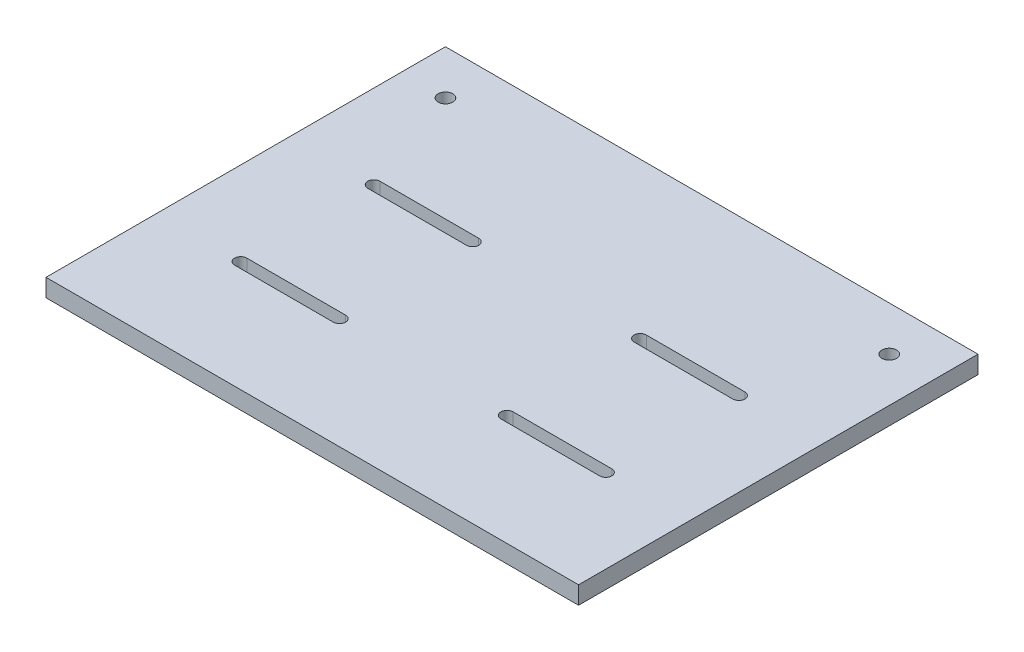
ISO-10303-21;
HEADER;
FILE_DESCRIPTION(('STEP AP214'),'2;1');
FILE_NAME('part.step','',(''),(''),'','','');
FILE_SCHEMA(('AUTOMOTIVE_DESIGN { 1 0 10303 214 1 1 1 1 }'));
ENDSEC;
DATA;
#1=APPLICATION_CONTEXT('core data for automotive mechanical design processes');
#2=APPLICATION_PROTOCOL_DEFINITION('international standard','automotive_design',2000,#1);
#3=PRODUCT_CONTEXT('',#1,'mechanical');
#4=PRODUCT('Part','Part','',(#3));
#5=PRODUCT_RELATED_PRODUCT_CATEGORY('part','',(#4));
#6=PRODUCT_DEFINITION_FORMATION('','',#4);
#7=PRODUCT_DEFINITION_CONTEXT('part definition',#1,'design');
#8=PRODUCT_DEFINITION('design','',#6,#7);
#9=PRODUCT_DEFINITION_SHAPE('','',#8);
#10=(LENGTH_UNIT() NAMED_UNIT(*) SI_UNIT(.MILLI.,.METRE.));
#11=(NAMED_UNIT(*) PLANE_ANGLE_UNIT() SI_UNIT($,.RADIAN.));
#12=(NAMED_UNIT(*) SI_UNIT($,.STERADIAN.) SOLID_ANGLE_UNIT());
#13=UNCERTAINTY_MEASURE_WITH_UNIT(LENGTH_MEASURE(1.E-05),#10,'distance_accuracy_value','');
#14=(GEOMETRIC_REPRESENTATION_CONTEXT(3) GLOBAL_UNCERTAINTY_ASSIGNED_CONTEXT((#13)) GLOBAL_UNIT_ASSIGNED_CONTEXT((#10,
#11,#12)) REPRESENTATION_CONTEXT('',''));
#15=CARTESIAN_POINT('',(0.,0.,0.));
#16=DIRECTION('',(0.,0.,1.));
#17=DIRECTION('',(1.,0.,0.));
#18=AXIS2_PLACEMENT_3D('',#15,#16,#17);
#19=CARTESIAN_POINT('',(0.,8.0023,0.));
#20=DIRECTION('',(0.,-1.,0.));
#21=DIRECTION('',(0.,0.,-1.));
#22=AXIS2_PLACEMENT_3D('',#19,#20,#21);
#23=PLANE('',#22);
#24=CARTESIAN_POINT('',(202.25,8.0023,130.));
#25=DIRECTION('',(0.,1.,0.));
#26=DIRECTION('',(0.,0.,1.));
#27=AXIS2_PLACEMENT_3D('',#24,#25,#26);
#28=CIRCLE('',#27,2.75);
#29=CARTESIAN_POINT('',(202.25,8.0023,127.25));
#30=VERTEX_POINT('',#29);
#31=CARTESIAN_POINT('',(202.25,8.0023,132.75));
#32=VERTEX_POINT('',#31);
#33=EDGE_CURVE('E252',#30,#32,#28,.F.);
#34=ORIENTED_EDGE('',*,*,#33,.T.);
#35=DIRECTION('',(1.,0.,0.));
#36=VECTOR('',#35,1.);
#37=CARTESIAN_POINT('',(157.75,8.0023,132.75));
#38=LINE('',#37,#36);
#39=CARTESIAN_POINT('',(157.75,8.0023,132.75));
#40=VERTEX_POINT('',#39);
#41=EDGE_CURVE('E181',#32,#40,#38,.F.);
#42=ORIENTED_EDGE('',*,*,#41,.T.);
#43=CARTESIAN_POINT('',(157.75,8.0023,130.));
#44=DIRECTION('',(0.,1.,0.));
#45=DIRECTION('',(0.,0.,1.));
#46=AXIS2_PLACEMENT_3D('',#43,#44,#45);
#47=CIRCLE('',#46,2.75);
#48=CARTESIAN_POINT('',(157.75,8.0023,127.25));
#49=VERTEX_POINT('',#48);
#50=EDGE_CURVE('E189',#40,#49,#47,.F.);
#51=ORIENTED_EDGE('',*,*,#50,.T.);
#52=DIRECTION('',(-1.,0.,0.));
#53=VECTOR('',#52,1.);
#54=CARTESIAN_POINT('',(202.25,8.0023,127.25));
#55=LINE('',#54,#53);
#56=EDGE_CURVE('E176',#49,#30,#55,.F.);
#57=ORIENTED_EDGE('',*,*,#56,.T.);
#58=EDGE_LOOP('',(#34,#42,#51,#57));
#59=FACE_BOUND('',#58,.T.);
#60=CARTESIAN_POINT('',(82.25,8.0023,130.));
#61=DIRECTION('',(0.,1.,0.));
#62=DIRECTION('',(0.,0.,1.));
#63=AXIS2_PLACEMENT_3D('',#60,#61,#62);
#64=CIRCLE('',#63,2.75);
#65=CARTESIAN_POINT('',(82.25,8.0023,127.25));
#66=VERTEX_POINT('',#65);
#67=CARTESIAN_POINT('',(82.25,8.0023,132.75));
#68=VERTEX_POINT('',#67);
#69=EDGE_CURVE('E256',#66,#68,#64,.F.);
#70=ORIENTED_EDGE('',*,*,#69,.T.);
#71=DIRECTION('',(1.,0.,0.));
#72=VECTOR('',#71,1.);
#73=CARTESIAN_POINT('',(37.75,8.0023,132.75));
#74=LINE('',#73,#72);
#75=CARTESIAN_POINT('',(37.75,8.0023,132.75));
#76=VERTEX_POINT('',#75);
#77=EDGE_CURVE('E191',#68,#76,#74,.F.);
#78=ORIENTED_EDGE('',*,*,#77,.T.);
#79=CARTESIAN_POINT('',(37.75,8.0023,130.));
#80=DIRECTION('',(0.,1.,0.));
#81=DIRECTION('',(0.,0.,1.));
#82=AXIS2_PLACEMENT_3D('',#79,#80,#81);
#83=CIRCLE('',#82,2.75);
#84=CARTESIAN_POINT('',(37.75,8.0023,127.25));
#85=VERTEX_POINT('',#84);
#86=EDGE_CURVE('E199',#76,#85,#83,.F.);
#87=ORIENTED_EDGE('',*,*,#86,.T.);
#88=DIRECTION('',(-1.,0.,0.));
#89=VECTOR('',#88,1.);
#90=CARTESIAN_POINT('',(82.25,8.0023,127.25));
#91=LINE('',#90,#89);
#92=EDGE_CURVE('E186',#85,#66,#91,.F.);
#93=ORIENTED_EDGE('',*,*,#92,.T.);
#94=EDGE_LOOP('',(#70,#78,#87,#93));
#95=FACE_BOUND('',#94,.T.);
#96=CARTESIAN_POINT('',(202.25,8.0023,70.));
#97=DIRECTION('',(0.,1.,0.));
#98=DIRECTION('',(0.,0.,1.));
#99=AXIS2_PLACEMENT_3D('',#96,#97,#98);
#100=CIRCLE('',#99,2.75);
#101=CARTESIAN_POINT('',(202.25,8.0023,67.25));
#102=VERTEX_POINT('',#101);
#103=CARTESIAN_POINT('',(202.25,8.0023,72.75));
#104=VERTEX_POINT('',#103);
#105=EDGE_CURVE('E261',#102,#104,#100,.F.);
#106=ORIENTED_EDGE('',*,*,#105,.T.);
#107=DIRECTION('',(1.,0.,0.));
#108=VECTOR('',#107,1.);
#109=CARTESIAN_POINT('',(157.75,8.0023,72.75));
#110=LINE('',#109,#108);
#111=CARTESIAN_POINT('',(157.75,8.0023,72.75));
#112=VERTEX_POINT('',#111);
#113=EDGE_CURVE('E201',#104,#112,#110,.F.);
#114=ORIENTED_EDGE('',*,*,#113,.T.);
#115=CARTESIAN_POINT('',(157.75,8.0023,70.));
#116=DIRECTION('',(0.,1.,0.));
#117=DIRECTION('',(0.,0.,1.));
#118=AXIS2_PLACEMENT_3D('',#115,#116,#117);
#119=CIRCLE('',#118,2.75);
#120=CARTESIAN_POINT('',(157.75,8.0023,67.25));
#121=VERTEX_POINT('',#120);
#122=EDGE_CURVE('E265',#112,#121,#119,.F.);
#123=ORIENTED_EDGE('',*,*,#122,.T.);
#124=DIRECTION('',(-1.,0.,0.));
#125=VECTOR('',#124,1.);
#126=CARTESIAN_POINT('',(202.25,8.0023,67.25));
#127=LINE('',#126,#125);
#128=EDGE_CURVE('E196',#121,#102,#127,.F.);
#129=ORIENTED_EDGE('',*,*,#128,.T.);
#130=EDGE_LOOP('',(#106,#114,#123,#129));
#131=FACE_BOUND('',#130,.T.);
#132=CARTESIAN_POINT('',(220.,8.0023,20.));
#133=DIRECTION('',(0.,-1.,0.));
#134=DIRECTION('',(0.,0.,-1.));
#135=AXIS2_PLACEMENT_3D('',#132,#133,#134);
#136=CIRCLE('',#135,3.3);
#137=CARTESIAN_POINT('',(220.,8.0023,16.7));
#138=VERTEX_POINT('',#137);
#139=EDGE_CURVE('E209',#138,#138,#136,.T.);
#140=ORIENTED_EDGE('',*,*,#139,.T.);
#141=EDGE_LOOP('',(#140));
#142=FACE_BOUND('',#141,.T.);
#143=CARTESIAN_POINT('',(82.25,8.0023,70.));
#144=DIRECTION('',(0.,1.,0.));
#145=DIRECTION('',(0.,0.,1.));
#146=AXIS2_PLACEMENT_3D('',#143,#144,#145);
#147=CIRCLE('',#146,2.75);
#148=CARTESIAN_POINT('',(82.25,8.0023,67.25));
#149=VERTEX_POINT('',#148);
#150=CARTESIAN_POINT('',(82.25,8.0023,72.75));
#151=VERTEX_POINT('',#150);
#152=EDGE_CURVE('E269',#149,#151,#147,.F.);
#153=ORIENTED_EDGE('',*,*,#152,.T.);
#154=DIRECTION('',(1.,0.,0.));
#155=VECTOR('',#154,1.);
#156=CARTESIAN_POINT('',(37.75,8.0023,72.75));
#157=LINE('',#156,#155);
#158=CARTESIAN_POINT('',(37.75,8.0023,72.75));
#159=VERTEX_POINT('',#158);
#160=EDGE_CURVE('E211',#151,#159,#157,.F.);
#161=ORIENTED_EDGE('',*,*,#160,.T.);
#162=CARTESIAN_POINT('',(37.75,8.0023,70.));
#163=DIRECTION('',(0.,1.,0.));
#164=DIRECTION('',(0.,0.,1.));
#165=AXIS2_PLACEMENT_3D('',#162,#163,#164);
#166=CIRCLE('',#165,2.75);
#167=CARTESIAN_POINT('',(37.75,8.0023,67.25));
#168=VERTEX_POINT('',#167);
#169=EDGE_CURVE('E130',#159,#168,#166,.F.);
#170=ORIENTED_EDGE('',*,*,#169,.T.);
#171=DIRECTION('',(-1.,0.,0.));
#172=VECTOR('',#171,1.);
#173=CARTESIAN_POINT('',(82.25,8.0023,67.25));
#174=LINE('',#173,#172);
#175=EDGE_CURVE('E206',#168,#149,#174,.F.);
#176=ORIENTED_EDGE('',*,*,#175,.T.);
#177=EDGE_LOOP('',(#153,#161,#170,#176));
#178=FACE_BOUND('',#177,.T.);
#179=CARTESIAN_POINT('',(20.,8.0023,20.));
#180=DIRECTION('',(0.,-1.,0.));
#181=DIRECTION('',(0.,0.,-1.));
#182=AXIS2_PLACEMENT_3D('',#179,#180,#181);
#183=CIRCLE('',#182,3.3);
#184=CARTESIAN_POINT('',(20.,8.0023,16.7));
#185=VERTEX_POINT('',#184);
#186=EDGE_CURVE('E19',#185,#185,#183,.T.);
#187=ORIENTED_EDGE('',*,*,#186,.T.);
#188=EDGE_LOOP('',(#187));
#189=FACE_BOUND('',#188,.T.);
#190=DIRECTION('',(0.,0.,-1.));
#191=VECTOR('',#190,1.);
#192=CARTESIAN_POINT('',(240.,8.0023,0.));
#193=LINE('',#192,#191);
#194=CARTESIAN_POINT('',(240.,8.0023,0.));
#195=VERTEX_POINT('',#194);
#196=CARTESIAN_POINT('',(240.,8.0023,180.));
#197=VERTEX_POINT('',#196);
#198=EDGE_CURVE('E150',#195,#197,#193,.F.);
#199=ORIENTED_EDGE('',*,*,#198,.F.);
#200=DIRECTION('',(1.,0.,0.));
#201=VECTOR('',#200,1.);
#202=CARTESIAN_POINT('',(0.,8.0023,0.));
#203=LINE('',#202,#201);
#204=CARTESIAN_POINT('',(0.,8.0023,0.));
#205=VERTEX_POINT('',#204);
#206=EDGE_CURVE('E148',#195,#205,#203,.F.);
#207=ORIENTED_EDGE('',*,*,#206,.T.);
#208=DIRECTION('',(0.,0.,-1.));
#209=VECTOR('',#208,1.);
#210=CARTESIAN_POINT('',(0.,8.0023,0.));
#211=LINE('',#210,#209);
#212=CARTESIAN_POINT('',(0.,8.0023,180.));
#213=VERTEX_POINT('',#212);
#214=EDGE_CURVE('E139',#205,#213,#211,.F.);
#215=ORIENTED_EDGE('',*,*,#214,.T.);
#216=DIRECTION('',(1.,0.,0.));
#217=VECTOR('',#216,1.);
#218=CARTESIAN_POINT('',(0.,8.0023,180.));
#219=LINE('',#218,#217);
#220=EDGE_CURVE('E283',#197,#213,#219,.F.);
#221=ORIENTED_EDGE('',*,*,#220,.F.);
#222=EDGE_LOOP('',(#199,#207,#215,#221));
#223=FACE_BOUND('',#222,.T.);
#224=ADVANCED_FACE('F16',(#59,#95,#131,#142,#178,#189,#223),#23,.F.);
#225=CARTESIAN_POINT('',(0.,8.0023,0.));
#226=DIRECTION('',(1.,0.,0.));
#227=DIRECTION('',(0.,0.,-1.));
#228=AXIS2_PLACEMENT_3D('',#225,#226,#227);
#229=PLANE('',#228);
#230=DIRECTION('',(0.,1.,0.));
#231=VECTOR('',#230,1.);
#232=CARTESIAN_POINT('',(0.,8.0023,180.));
#233=LINE('',#232,#231);
#234=CARTESIAN_POINT('',(0.,0.00230000000001991,180.));
#235=VERTEX_POINT('',#234);
#236=EDGE_CURVE('E164',#213,#235,#233,.F.);
#237=ORIENTED_EDGE('',*,*,#236,.F.);
#238=ORIENTED_EDGE('',*,*,#214,.F.);
#239=DIRECTION('',(0.,1.,0.));
#240=VECTOR('',#239,1.);
#241=CARTESIAN_POINT('',(0.,8.0023,0.));
#242=LINE('',#241,#240);
#243=CARTESIAN_POINT('',(0.,0.00230000000001991,0.));
#244=VERTEX_POINT('',#243);
#245=EDGE_CURVE('E155',#205,#244,#242,.F.);
#246=ORIENTED_EDGE('',*,*,#245,.T.);
#247=DIRECTION('',(0.,0.,-1.));
#248=VECTOR('',#247,1.);
#249=CARTESIAN_POINT('',(0.,0.002300000000105,0.));
#250=LINE('',#249,#248);
#251=EDGE_CURVE('E179',#235,#244,#250,.T.);
#252=ORIENTED_EDGE('',*,*,#251,.F.);
#253=EDGE_LOOP('',(#237,#238,#246,#252));
#254=FACE_BOUND('',#253,.T.);
#255=ADVANCED_FACE('F159',(#254),#229,.F.);
#256=CARTESIAN_POINT('',(0.,8.0023,0.));
#257=DIRECTION('',(0.,0.,1.));
#258=DIRECTION('',(1.,0.,0.));
#259=AXIS2_PLACEMENT_3D('',#256,#257,#258);
#260=PLANE('',#259);
#261=DIRECTION('',(1.,0.,0.));
#262=VECTOR('',#261,1.);
#263=CARTESIAN_POINT('',(0.,0.002300000000105,0.));
#264=LINE('',#263,#262);
#265=CARTESIAN_POINT('',(240.,0.00230000000001991,0.));
#266=VERTEX_POINT('',#265);
#267=EDGE_CURVE('E169',#244,#266,#264,.T.);
#268=ORIENTED_EDGE('',*,*,#267,.F.);
#269=ORIENTED_EDGE('',*,*,#245,.F.);
#270=ORIENTED_EDGE('',*,*,#206,.F.);
#271=DIRECTION('',(0.,1.,0.));
#272=VECTOR('',#271,1.);
#273=CARTESIAN_POINT('',(240.,8.0023,0.));
#274=LINE('',#273,#272);
#275=EDGE_CURVE('E171',#266,#195,#274,.T.);
#276=ORIENTED_EDGE('',*,*,#275,.F.);
#277=EDGE_LOOP('',(#268,#269,#270,#276));
#278=FACE_BOUND('',#277,.T.);
#279=ADVANCED_FACE('F167',(#278),#260,.F.);
#280=CARTESIAN_POINT('',(240.,8.0023,0.));
#281=DIRECTION('',(1.,0.,0.));
#282=DIRECTION('',(0.,0.,-1.));
#283=AXIS2_PLACEMENT_3D('',#280,#281,#282);
#284=PLANE('',#283);
#285=DIRECTION('',(0.,1.,0.));
#286=VECTOR('',#285,1.);
#287=CARTESIAN_POINT('',(240.,8.0023,180.));
#288=LINE('',#287,#286);
#289=CARTESIAN_POINT('',(240.,0.00230000000001991,180.));
#290=VERTEX_POINT('',#289);
#291=EDGE_CURVE('E275',#290,#197,#288,.T.);
#292=ORIENTED_EDGE('',*,*,#291,.F.);
#293=DIRECTION('',(0.,0.,-1.));
#294=VECTOR('',#293,1.);
#295=CARTESIAN_POINT('',(240.,0.002300000000105,0.));
#296=LINE('',#295,#294);
#297=EDGE_CURVE('E292',#266,#290,#296,.F.);
#298=ORIENTED_EDGE('',*,*,#297,.F.);
#299=ORIENTED_EDGE('',*,*,#275,.T.);
#300=ORIENTED_EDGE('',*,*,#198,.T.);
#301=EDGE_LOOP('',(#292,#298,#299,#300));
#302=FACE_BOUND('',#301,.T.);
#303=ADVANCED_FACE('F288',(#302),#284,.T.);
#304=CARTESIAN_POINT('',(0.,8.0023,180.));
#305=DIRECTION('',(0.,0.,1.));
#306=DIRECTION('',(1.,0.,0.));
#307=AXIS2_PLACEMENT_3D('',#304,#305,#306);
#308=PLANE('',#307);
#309=DIRECTION('',(1.,0.,0.));
#310=VECTOR('',#309,1.);
#311=CARTESIAN_POINT('',(0.,0.002300000000105,180.));
#312=LINE('',#311,#310);
#313=EDGE_CURVE('E251',#290,#235,#312,.F.);
#314=ORIENTED_EDGE('',*,*,#313,.F.);
#315=ORIENTED_EDGE('',*,*,#291,.T.);
#316=ORIENTED_EDGE('',*,*,#220,.T.);
#317=ORIENTED_EDGE('',*,*,#236,.T.);
#318=EDGE_LOOP('',(#314,#315,#316,#317));
#319=FACE_BOUND('',#318,.T.);
#320=ADVANCED_FACE('F299',(#319),#308,.T.);
#321=CARTESIAN_POINT('',(20.,8.0023,20.));
#322=DIRECTION('',(0.,-1.,0.));
#323=DIRECTION('',(0.,0.,-1.));
#324=AXIS2_PLACEMENT_3D('',#321,#322,#323);
#325=CYLINDRICAL_SURFACE('',#324,3.3);
#326=ORIENTED_EDGE('',*,*,#186,.F.);
#327=EDGE_LOOP('',(#326));
#328=FACE_BOUND('',#327,.T.);
#329=CARTESIAN_POINT('',(20.,0.00229999999999154,20.));
#330=DIRECTION('',(0.,-1.,0.));
#331=DIRECTION('',(0.,0.,-1.));
#332=AXIS2_PLACEMENT_3D('',#329,#330,#331);
#333=CIRCLE('',#332,3.3);
#334=CARTESIAN_POINT('',(20.,0.00229999999999154,16.7));
#335=VERTEX_POINT('',#334);
#336=EDGE_CURVE('E248',#335,#335,#333,.F.);
#337=ORIENTED_EDGE('',*,*,#336,.F.);
#338=EDGE_LOOP('',(#337));
#339=FACE_BOUND('',#338,.T.);
#340=ADVANCED_FACE('F415',(#328,#339),#325,.F.);
#341=CARTESIAN_POINT('',(37.75,8.0023,70.));
#342=DIRECTION('',(0.,1.,0.));
#343=DIRECTION('',(0.,0.,1.));
#344=AXIS2_PLACEMENT_3D('',#341,#342,#343);
#345=CYLINDRICAL_SURFACE('',#344,2.75);
#346=DIRECTION('',(0.,1.,0.));
#347=VECTOR('',#346,1.);
#348=CARTESIAN_POINT('',(37.75,8.0023,72.75));
#349=LINE('',#348,#347);
#350=CARTESIAN_POINT('',(37.75,0.0023000000000481,72.75));
#351=VERTEX_POINT('',#350);
#352=EDGE_CURVE('E214',#159,#351,#349,.F.);
#353=ORIENTED_EDGE('',*,*,#352,.T.);
#354=CARTESIAN_POINT('',(37.75,0.00229999999999154,70.));
#355=DIRECTION('',(0.,1.,0.));
#356=DIRECTION('',(0.,0.,1.));
#357=AXIS2_PLACEMENT_3D('',#354,#355,#356);
#358=CIRCLE('',#357,2.75);
#359=CARTESIAN_POINT('',(37.75,0.0023000000000481,67.25));
#360=VERTEX_POINT('',#359);
#361=EDGE_CURVE('E245',#360,#351,#358,.T.);
#362=ORIENTED_EDGE('',*,*,#361,.F.);
#363=DIRECTION('',(0.,1.,0.));
#364=VECTOR('',#363,1.);
#365=CARTESIAN_POINT('',(37.75,8.0023,67.25));
#366=LINE('',#365,#364);
#367=EDGE_CURVE('E210',#360,#168,#366,.T.);
#368=ORIENTED_EDGE('',*,*,#367,.T.);
#369=ORIENTED_EDGE('',*,*,#169,.F.);
#370=EDGE_LOOP('',(#353,#362,#368,#369));
#371=FACE_BOUND('',#370,.T.);
#372=ADVANCED_FACE('F338',(#371),#345,.F.);
#373=CARTESIAN_POINT('',(37.75,8.0023,72.75));
#374=DIRECTION('',(0.,0.,1.));
#375=DIRECTION('',(1.,0.,0.));
#376=AXIS2_PLACEMENT_3D('',#373,#374,#375);
#377=PLANE('',#376);
#378=DIRECTION('',(0.,1.,0.));
#379=VECTOR('',#378,1.);
#380=CARTESIAN_POINT('',(82.25,8.0023,72.75));
#381=LINE('',#380,#379);
#382=CARTESIAN_POINT('',(82.25,0.0023000000000481,72.75));
#383=VERTEX_POINT('',#382);
#384=EDGE_CURVE('E213',#151,#383,#381,.F.);
#385=ORIENTED_EDGE('',*,*,#384,.T.);
#386=DIRECTION('',(1.,0.,0.));
#387=VECTOR('',#386,1.);
#388=CARTESIAN_POINT('',(0.,0.002300000000105,72.75));
#389=LINE('',#388,#387);
#390=EDGE_CURVE('E244',#351,#383,#389,.T.);
#391=ORIENTED_EDGE('',*,*,#390,.F.);
#392=ORIENTED_EDGE('',*,*,#352,.F.);
#393=ORIENTED_EDGE('',*,*,#160,.F.);
#394=EDGE_LOOP('',(#385,#391,#392,#393));
#395=FACE_BOUND('',#394,.T.);
#396=ADVANCED_FACE('F327',(#395),#377,.F.);
#397=CARTESIAN_POINT('',(82.25,8.0023,70.));
#398=DIRECTION('',(0.,1.,0.));
#399=DIRECTION('',(0.,0.,1.));
#400=AXIS2_PLACEMENT_3D('',#397,#398,#399);
#401=CYLINDRICAL_SURFACE('',#400,2.75);
#402=DIRECTION('',(0.,1.,0.));
#403=VECTOR('',#402,1.);
#404=CARTESIAN_POINT('',(82.25,8.0023,67.25));
#405=LINE('',#404,#403);
#406=CARTESIAN_POINT('',(82.25,0.0023000000000481,67.25));
#407=VERTEX_POINT('',#406);
#408=EDGE_CURVE('E271',#149,#407,#405,.F.);
#409=ORIENTED_EDGE('',*,*,#408,.T.);
#410=CARTESIAN_POINT('',(82.25,0.00229999999999154,70.));
#411=DIRECTION('',(0.,1.,0.));
#412=DIRECTION('',(0.,0.,1.));
#413=AXIS2_PLACEMENT_3D('',#410,#411,#412);
#414=CIRCLE('',#413,2.75);
#415=EDGE_CURVE('E241',#383,#407,#414,.T.);
#416=ORIENTED_EDGE('',*,*,#415,.F.);
#417=ORIENTED_EDGE('',*,*,#384,.F.);
#418=ORIENTED_EDGE('',*,*,#152,.F.);
#419=EDGE_LOOP('',(#409,#416,#417,#418));
#420=FACE_BOUND('',#419,.T.);
#421=ADVANCED_FACE('F331',(#420),#401,.F.);
#422=CARTESIAN_POINT('',(82.25,8.0023,67.25));
#423=DIRECTION('',(0.,0.,-1.));
#424=DIRECTION('',(-1.,0.,0.));
#425=AXIS2_PLACEMENT_3D('',#422,#423,#424);
#426=PLANE('',#425);
#427=ORIENTED_EDGE('',*,*,#367,.F.);
#428=DIRECTION('',(1.,0.,0.));
#429=VECTOR('',#428,1.);
#430=CARTESIAN_POINT('',(0.,0.002300000000105,67.25));
#431=LINE('',#430,#429);
#432=EDGE_CURVE('E240',#407,#360,#431,.F.);
#433=ORIENTED_EDGE('',*,*,#432,.F.);
#434=ORIENTED_EDGE('',*,*,#408,.F.);
#435=ORIENTED_EDGE('',*,*,#175,.F.);
#436=EDGE_LOOP('',(#427,#433,#434,#435));
#437=FACE_BOUND('',#436,.T.);
#438=ADVANCED_FACE('F341',(#437),#426,.F.);
#439=CARTESIAN_POINT('',(220.,8.0023,20.));
#440=DIRECTION('',(0.,-1.,0.));
#441=DIRECTION('',(0.,0.,-1.));
#442=AXIS2_PLACEMENT_3D('',#439,#440,#441);
#443=CYLINDRICAL_SURFACE('',#442,3.3);
#444=ORIENTED_EDGE('',*,*,#139,.F.);
#445=EDGE_LOOP('',(#444));
#446=FACE_BOUND('',#445,.T.);
#447=CARTESIAN_POINT('',(220.,0.00229999999999154,20.));
#448=DIRECTION('',(0.,-1.,0.));
#449=DIRECTION('',(0.,0.,-1.));
#450=AXIS2_PLACEMENT_3D('',#447,#448,#449);
#451=CIRCLE('',#450,3.3);
#452=CARTESIAN_POINT('',(220.,0.00229999999999154,16.7));
#453=VERTEX_POINT('',#452);
#454=EDGE_CURVE('E237',#453,#453,#451,.F.);
#455=ORIENTED_EDGE('',*,*,#454,.F.);
#456=EDGE_LOOP('',(#455));
#457=FACE_BOUND('',#456,.T.);
#458=ADVANCED_FACE('F402',(#446,#457),#443,.F.);
#459=CARTESIAN_POINT('',(157.75,8.0023,70.));
#460=DIRECTION('',(0.,1.,0.));
#461=DIRECTION('',(0.,0.,1.));
#462=AXIS2_PLACEMENT_3D('',#459,#460,#461);
#463=CYLINDRICAL_SURFACE('',#462,2.75);
#464=DIRECTION('',(0.,1.,0.));
#465=VECTOR('',#464,1.);
#466=CARTESIAN_POINT('',(157.75,8.0023,72.75));
#467=LINE('',#466,#465);
#468=CARTESIAN_POINT('',(157.75,0.0023000000000481,72.75));
#469=VERTEX_POINT('',#468);
#470=EDGE_CURVE('E205',#112,#469,#467,.F.);
#471=ORIENTED_EDGE('',*,*,#470,.T.);
#472=CARTESIAN_POINT('',(157.75,0.00229999999999154,70.));
#473=DIRECTION('',(0.,1.,0.));
#474=DIRECTION('',(0.,0.,1.));
#475=AXIS2_PLACEMENT_3D('',#472,#473,#474);
#476=CIRCLE('',#475,2.75);
#477=CARTESIAN_POINT('',(157.75,0.0023000000000481,67.25));
#478=VERTEX_POINT('',#477);
#479=EDGE_CURVE('E234',#478,#469,#476,.T.);
#480=ORIENTED_EDGE('',*,*,#479,.F.);
#481=DIRECTION('',(0.,1.,0.));
#482=VECTOR('',#481,1.);
#483=CARTESIAN_POINT('',(157.75,8.0023,67.25));
#484=LINE('',#483,#482);
#485=EDGE_CURVE('E200',#478,#121,#484,.T.);
#486=ORIENTED_EDGE('',*,*,#485,.T.);
#487=ORIENTED_EDGE('',*,*,#122,.F.);
#488=EDGE_LOOP('',(#471,#480,#486,#487));
#489=FACE_BOUND('',#488,.T.);
#490=ADVANCED_FACE('F398',(#489),#463,.F.);
#491=CARTESIAN_POINT('',(157.75,8.0023,72.75));
#492=DIRECTION('',(0.,0.,1.));
#493=DIRECTION('',(1.,0.,0.));
#494=AXIS2_PLACEMENT_3D('',#491,#492,#493);
#495=PLANE('',#494);
#496=DIRECTION('',(0.,1.,0.));
#497=VECTOR('',#496,1.);
#498=CARTESIAN_POINT('',(202.25,8.0023,72.75));
#499=LINE('',#498,#497);
#500=CARTESIAN_POINT('',(202.25,0.0023000000000481,72.75));
#501=VERTEX_POINT('',#500);
#502=EDGE_CURVE('E204',#104,#501,#499,.F.);
#503=ORIENTED_EDGE('',*,*,#502,.T.);
#504=DIRECTION('',(1.,0.,0.));
#505=VECTOR('',#504,1.);
#506=CARTESIAN_POINT('',(0.,0.002300000000105,72.75));
#507=LINE('',#506,#505);
#508=EDGE_CURVE('E233',#469,#501,#507,.T.);
#509=ORIENTED_EDGE('',*,*,#508,.F.);
#510=ORIENTED_EDGE('',*,*,#470,.F.);
#511=ORIENTED_EDGE('',*,*,#113,.F.);
#512=EDGE_LOOP('',(#503,#509,#510,#511));
#513=FACE_BOUND('',#512,.T.);
#514=ADVANCED_FACE('F394',(#513),#495,.F.);
#515=CARTESIAN_POINT('',(202.25,8.0023,70.));
#516=DIRECTION('',(0.,1.,0.));
#517=DIRECTION('',(0.,0.,1.));
#518=AXIS2_PLACEMENT_3D('',#515,#516,#517);
#519=CYLINDRICAL_SURFACE('',#518,2.75);
#520=DIRECTION('',(0.,1.,0.));
#521=VECTOR('',#520,1.);
#522=CARTESIAN_POINT('',(202.25,8.0023,67.25));
#523=LINE('',#522,#521);
#524=CARTESIAN_POINT('',(202.25,0.0023000000000481,67.25));
#525=VERTEX_POINT('',#524);
#526=EDGE_CURVE('E264',#102,#525,#523,.F.);
#527=ORIENTED_EDGE('',*,*,#526,.T.);
#528=CARTESIAN_POINT('',(202.25,0.00229999999999154,70.));
#529=DIRECTION('',(0.,1.,0.));
#530=DIRECTION('',(0.,0.,1.));
#531=AXIS2_PLACEMENT_3D('',#528,#529,#530);
#532=CIRCLE('',#531,2.75);
#533=EDGE_CURVE('E230',#501,#525,#532,.T.);
#534=ORIENTED_EDGE('',*,*,#533,.F.);
#535=ORIENTED_EDGE('',*,*,#502,.F.);
#536=ORIENTED_EDGE('',*,*,#105,.F.);
#537=EDGE_LOOP('',(#527,#534,#535,#536));
#538=FACE_BOUND('',#537,.T.);
#539=ADVANCED_FACE('F390',(#538),#519,.F.);
#540=CARTESIAN_POINT('',(202.25,8.0023,67.25));
#541=DIRECTION('',(0.,0.,-1.));
#542=DIRECTION('',(-1.,0.,0.));
#543=AXIS2_PLACEMENT_3D('',#540,#541,#542);
#544=PLANE('',#543);
#545=ORIENTED_EDGE('',*,*,#485,.F.);
#546=DIRECTION('',(1.,0.,0.));
#547=VECTOR('',#546,1.);
#548=CARTESIAN_POINT('',(0.,0.002300000000105,67.25));
#549=LINE('',#548,#547);
#550=EDGE_CURVE('E229',#525,#478,#549,.F.);
#551=ORIENTED_EDGE('',*,*,#550,.F.);
#552=ORIENTED_EDGE('',*,*,#526,.F.);
#553=ORIENTED_EDGE('',*,*,#128,.F.);
#554=EDGE_LOOP('',(#545,#551,#552,#553));
#555=FACE_BOUND('',#554,.T.);
#556=ADVANCED_FACE('F386',(#555),#544,.F.);
#557=CARTESIAN_POINT('',(37.75,8.0023,130.));
#558=DIRECTION('',(0.,1.,0.));
#559=DIRECTION('',(0.,0.,1.));
#560=AXIS2_PLACEMENT_3D('',#557,#558,#559);
#561=CYLINDRICAL_SURFACE('',#560,2.75);
#562=DIRECTION('',(0.,1.,0.));
#563=VECTOR('',#562,1.);
#564=CARTESIAN_POINT('',(37.75,8.0023,132.75));
#565=LINE('',#564,#563);
#566=CARTESIAN_POINT('',(37.75,0.0023000000000481,132.75));
#567=VERTEX_POINT('',#566);
#568=EDGE_CURVE('E195',#76,#567,#565,.F.);
#569=ORIENTED_EDGE('',*,*,#568,.T.);
#570=CARTESIAN_POINT('',(37.75,0.00229999999999154,130.));
#571=DIRECTION('',(0.,1.,0.));
#572=DIRECTION('',(0.,0.,1.));
#573=AXIS2_PLACEMENT_3D('',#570,#571,#572);
#574=CIRCLE('',#573,2.75);
#575=CARTESIAN_POINT('',(37.75,0.0023000000000481,127.25));
#576=VERTEX_POINT('',#575);
#577=EDGE_CURVE('E226',#576,#567,#574,.T.);
#578=ORIENTED_EDGE('',*,*,#577,.F.);
#579=DIRECTION('',(0.,1.,0.));
#580=VECTOR('',#579,1.);
#581=CARTESIAN_POINT('',(37.75,8.0023,127.25));
#582=LINE('',#581,#580);
#583=EDGE_CURVE('E190',#576,#85,#582,.T.);
#584=ORIENTED_EDGE('',*,*,#583,.T.);
#585=ORIENTED_EDGE('',*,*,#86,.F.);
#586=EDGE_LOOP('',(#569,#578,#584,#585));
#587=FACE_BOUND('',#586,.T.);
#588=ADVANCED_FACE('F382',(#587),#561,.F.);
#589=CARTESIAN_POINT('',(37.75,8.0023,132.75));
#590=DIRECTION('',(0.,0.,1.));
#591=DIRECTION('',(1.,0.,0.));
#592=AXIS2_PLACEMENT_3D('',#589,#590,#591);
#593=PLANE('',#592);
#594=DIRECTION('',(0.,1.,0.));
#595=VECTOR('',#594,1.);
#596=CARTESIAN_POINT('',(82.25,8.0023,132.75));
#597=LINE('',#596,#595);
#598=CARTESIAN_POINT('',(82.25,0.0023000000000481,132.75));
#599=VERTEX_POINT('',#598);
#600=EDGE_CURVE('E194',#68,#599,#597,.F.);
#601=ORIENTED_EDGE('',*,*,#600,.T.);
#602=DIRECTION('',(1.,0.,0.));
#603=VECTOR('',#602,1.);
#604=CARTESIAN_POINT('',(0.,0.002300000000105,132.75));
#605=LINE('',#604,#603);
#606=EDGE_CURVE('E225',#567,#599,#605,.T.);
#607=ORIENTED_EDGE('',*,*,#606,.F.);
#608=ORIENTED_EDGE('',*,*,#568,.F.);
#609=ORIENTED_EDGE('',*,*,#77,.F.);
#610=EDGE_LOOP('',(#601,#607,#608,#609));
#611=FACE_BOUND('',#610,.T.);
#612=ADVANCED_FACE('F378',(#611),#593,.F.);
#613=CARTESIAN_POINT('',(82.25,8.0023,130.));
#614=DIRECTION('',(0.,1.,0.));
#615=DIRECTION('',(0.,0.,1.));
#616=AXIS2_PLACEMENT_3D('',#613,#614,#615);
#617=CYLINDRICAL_SURFACE('',#616,2.75);
#618=DIRECTION('',(0.,1.,0.));
#619=VECTOR('',#618,1.);
#620=CARTESIAN_POINT('',(82.25,8.0023,127.25));
#621=LINE('',#620,#619);
#622=CARTESIAN_POINT('',(82.25,0.0023000000000481,127.25));
#623=VERTEX_POINT('',#622);
#624=EDGE_CURVE('E259',#66,#623,#621,.F.);
#625=ORIENTED_EDGE('',*,*,#624,.T.);
#626=CARTESIAN_POINT('',(82.25,0.00229999999999154,130.));
#627=DIRECTION('',(0.,1.,0.));
#628=DIRECTION('',(0.,0.,1.));
#629=AXIS2_PLACEMENT_3D('',#626,#627,#628);
#630=CIRCLE('',#629,2.75);
#631=EDGE_CURVE('E222',#599,#623,#630,.T.);
#632=ORIENTED_EDGE('',*,*,#631,.F.);
#633=ORIENTED_EDGE('',*,*,#600,.F.);
#634=ORIENTED_EDGE('',*,*,#69,.F.);
#635=EDGE_LOOP('',(#625,#632,#633,#634));
#636=FACE_BOUND('',#635,.T.);
#637=ADVANCED_FACE('F374',(#636),#617,.F.);
#638=CARTESIAN_POINT('',(82.25,8.0023,127.25));
#639=DIRECTION('',(0.,0.,-1.));
#640=DIRECTION('',(-1.,0.,0.));
#641=AXIS2_PLACEMENT_3D('',#638,#639,#640);
#642=PLANE('',#641);
#643=ORIENTED_EDGE('',*,*,#583,.F.);
#644=DIRECTION('',(1.,0.,0.));
#645=VECTOR('',#644,1.);
#646=CARTESIAN_POINT('',(0.,0.002300000000105,127.25));
#647=LINE('',#646,#645);
#648=EDGE_CURVE('E221',#623,#576,#647,.F.);
#649=ORIENTED_EDGE('',*,*,#648,.F.);
#650=ORIENTED_EDGE('',*,*,#624,.F.);
#651=ORIENTED_EDGE('',*,*,#92,.F.);
#652=EDGE_LOOP('',(#643,#649,#650,#651));
#653=FACE_BOUND('',#652,.T.);
#654=ADVANCED_FACE('F370',(#653),#642,.F.);
#655=CARTESIAN_POINT('',(157.75,8.0023,130.));
#656=DIRECTION('',(0.,1.,0.));
#657=DIRECTION('',(0.,0.,1.));
#658=AXIS2_PLACEMENT_3D('',#655,#656,#657);
#659=CYLINDRICAL_SURFACE('',#658,2.75);
#660=DIRECTION('',(0.,1.,0.));
#661=VECTOR('',#660,1.);
#662=CARTESIAN_POINT('',(157.75,8.0023,132.75));
#663=LINE('',#662,#661);
#664=CARTESIAN_POINT('',(157.75,0.0023000000000481,132.75));
#665=VERTEX_POINT('',#664);
#666=EDGE_CURVE('E185',#40,#665,#663,.F.);
#667=ORIENTED_EDGE('',*,*,#666,.T.);
#668=CARTESIAN_POINT('',(157.75,0.00229999999999154,130.));
#669=DIRECTION('',(0.,1.,0.));
#670=DIRECTION('',(0.,0.,1.));
#671=AXIS2_PLACEMENT_3D('',#668,#669,#670);
#672=CIRCLE('',#671,2.75);
#673=CARTESIAN_POINT('',(157.75,0.0023000000000481,127.25));
#674=VERTEX_POINT('',#673);
#675=EDGE_CURVE('E218',#674,#665,#672,.T.);
#676=ORIENTED_EDGE('',*,*,#675,.F.);
#677=DIRECTION('',(0.,1.,0.));
#678=VECTOR('',#677,1.);
#679=CARTESIAN_POINT('',(157.75,8.0023,127.25));
#680=LINE('',#679,#678);
#681=EDGE_CURVE('E180',#674,#49,#680,.T.);
#682=ORIENTED_EDGE('',*,*,#681,.T.);
#683=ORIENTED_EDGE('',*,*,#50,.F.);
#684=EDGE_LOOP('',(#667,#676,#682,#683));
#685=FACE_BOUND('',#684,.T.);
#686=ADVANCED_FACE('F366',(#685),#659,.F.);
#687=CARTESIAN_POINT('',(157.75,8.0023,132.75));
#688=DIRECTION('',(0.,0.,1.));
#689=DIRECTION('',(1.,0.,0.));
#690=AXIS2_PLACEMENT_3D('',#687,#688,#689);
#691=PLANE('',#690);
#692=DIRECTION('',(0.,1.,0.));
#693=VECTOR('',#692,1.);
#694=CARTESIAN_POINT('',(202.25,8.0023,132.75));
#695=LINE('',#694,#693);
#696=CARTESIAN_POINT('',(202.25,0.0023000000000481,132.75));
#697=VERTEX_POINT('',#696);
#698=EDGE_CURVE('E184',#32,#697,#695,.F.);
#699=ORIENTED_EDGE('',*,*,#698,.T.);
#700=DIRECTION('',(1.,0.,0.));
#701=VECTOR('',#700,1.);
#702=CARTESIAN_POINT('',(0.,0.002300000000105,132.75));
#703=LINE('',#702,#701);
#704=EDGE_CURVE('E217',#665,#697,#703,.T.);
#705=ORIENTED_EDGE('',*,*,#704,.F.);
#706=ORIENTED_EDGE('',*,*,#666,.F.);
#707=ORIENTED_EDGE('',*,*,#41,.F.);
#708=EDGE_LOOP('',(#699,#705,#706,#707));
#709=FACE_BOUND('',#708,.T.);
#710=ADVANCED_FACE('F363',(#709),#691,.F.);
#711=CARTESIAN_POINT('',(202.25,8.0023,130.));
#712=DIRECTION('',(0.,1.,0.));
#713=DIRECTION('',(0.,0.,1.));
#714=AXIS2_PLACEMENT_3D('',#711,#712,#713);
#715=CYLINDRICAL_SURFACE('',#714,2.75);
#716=DIRECTION('',(0.,1.,0.));
#717=VECTOR('',#716,1.);
#718=CARTESIAN_POINT('',(202.25,8.0023,127.25));
#719=LINE('',#718,#717);
#720=CARTESIAN_POINT('',(202.25,0.0023000000000481,127.25));
#721=VERTEX_POINT('',#720);
#722=EDGE_CURVE('E34',#30,#721,#719,.F.);
#723=ORIENTED_EDGE('',*,*,#722,.T.);
#724=CARTESIAN_POINT('',(202.25,0.00229999999999154,130.));
#725=DIRECTION('',(0.,1.,0.));
#726=DIRECTION('',(0.,0.,1.));
#727=AXIS2_PLACEMENT_3D('',#724,#725,#726);
#728=CIRCLE('',#727,2.75);
#729=EDGE_CURVE('E25',#697,#721,#728,.T.);
#730=ORIENTED_EDGE('',*,*,#729,.F.);
#731=ORIENTED_EDGE('',*,*,#698,.F.);
#732=ORIENTED_EDGE('',*,*,#33,.F.);
#733=EDGE_LOOP('',(#723,#730,#731,#732));
#734=FACE_BOUND('',#733,.T.);
#735=ADVANCED_FACE('F356',(#734),#715,.F.);
#736=CARTESIAN_POINT('',(202.25,8.0023,127.25));
#737=DIRECTION('',(0.,0.,-1.));
#738=DIRECTION('',(-1.,0.,0.));
#739=AXIS2_PLACEMENT_3D('',#736,#737,#738);
#740=PLANE('',#739);
#741=ORIENTED_EDGE('',*,*,#681,.F.);
#742=DIRECTION('',(1.,0.,0.));
#743=VECTOR('',#742,1.);
#744=CARTESIAN_POINT('',(0.,0.002300000000105,127.25));
#745=LINE('',#744,#743);
#746=EDGE_CURVE('E11',#721,#674,#745,.F.);
#747=ORIENTED_EDGE('',*,*,#746,.F.);
#748=ORIENTED_EDGE('',*,*,#722,.F.);
#749=ORIENTED_EDGE('',*,*,#56,.F.);
#750=EDGE_LOOP('',(#741,#747,#748,#749));
#751=FACE_BOUND('',#750,.T.);
#752=ADVANCED_FACE('F350',(#751),#740,.F.);
#753=CARTESIAN_POINT('',(0.,0.002300000000105,0.));
#754=DIRECTION('',(0.,-1.,0.));
#755=DIRECTION('',(0.,0.,-1.));
#756=AXIS2_PLACEMENT_3D('',#753,#754,#755);
#757=PLANE('',#756);
#758=ORIENTED_EDGE('',*,*,#729,.T.);
#759=ORIENTED_EDGE('',*,*,#746,.T.);
#760=ORIENTED_EDGE('',*,*,#675,.T.);
#761=ORIENTED_EDGE('',*,*,#704,.T.);
#762=EDGE_LOOP('',(#758,#759,#760,#761));
#763=FACE_BOUND('',#762,.T.);
#764=ORIENTED_EDGE('',*,*,#631,.T.);
#765=ORIENTED_EDGE('',*,*,#648,.T.);
#766=ORIENTED_EDGE('',*,*,#577,.T.);
#767=ORIENTED_EDGE('',*,*,#606,.T.);
#768=EDGE_LOOP('',(#764,#765,#766,#767));
#769=FACE_BOUND('',#768,.T.);
#770=ORIENTED_EDGE('',*,*,#533,.T.);
#771=ORIENTED_EDGE('',*,*,#550,.T.);
#772=ORIENTED_EDGE('',*,*,#479,.T.);
#773=ORIENTED_EDGE('',*,*,#508,.T.);
#774=EDGE_LOOP('',(#770,#771,#772,#773));
#775=FACE_BOUND('',#774,.T.);
#776=ORIENTED_EDGE('',*,*,#454,.T.);
#777=EDGE_LOOP('',(#776));
#778=FACE_BOUND('',#777,.T.);
#779=ORIENTED_EDGE('',*,*,#415,.T.);
#780=ORIENTED_EDGE('',*,*,#432,.T.);
#781=ORIENTED_EDGE('',*,*,#361,.T.);
#782=ORIENTED_EDGE('',*,*,#390,.T.);
#783=EDGE_LOOP('',(#779,#780,#781,#782));
#784=FACE_BOUND('',#783,.T.);
#785=ORIENTED_EDGE('',*,*,#336,.T.);
#786=EDGE_LOOP('',(#785));
#787=FACE_BOUND('',#786,.T.);
#788=ORIENTED_EDGE('',*,*,#297,.T.);
#789=ORIENTED_EDGE('',*,*,#313,.T.);
#790=ORIENTED_EDGE('',*,*,#251,.T.);
#791=ORIENTED_EDGE('',*,*,#267,.T.);
#792=EDGE_LOOP('',(#788,#789,#790,#791));
#793=FACE_BOUND('',#792,.T.);
#794=ADVANCED_FACE('F300',(#763,#769,#775,#778,#784,#787,#793),#757,.T.);
#795=CLOSED_SHELL('',(#224,#255,#279,#303,#320,#340,#372,#396,#421,#438,#458,#490,#514,#539,
#556,#588,#612,#637,#654,#686,#710,#735,#752,#794));
#796=MANIFOLD_SOLID_BREP('B1',#795);
#797=ADVANCED_BREP_SHAPE_REPRESENTATION('',(#18,#796),#14);
#798=SHAPE_DEFINITION_REPRESENTATION(#9,#797);
ENDSEC;
END-ISO-10303-21;
